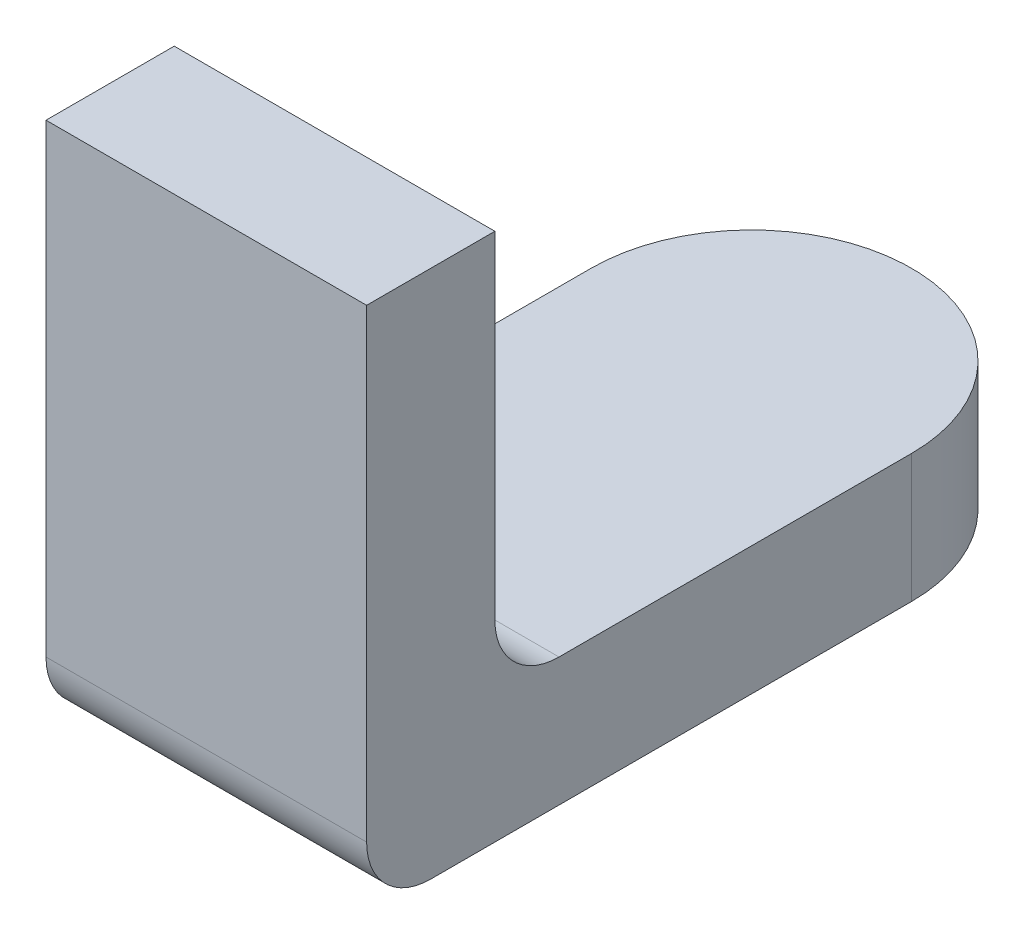
ISO-10303-21;
HEADER;
FILE_DESCRIPTION(('STEP AP214'),'2;1');
FILE_NAME('part.step','',(''),(''),'','','');
FILE_SCHEMA(('AUTOMOTIVE_DESIGN { 1 0 10303 214 1 1 1 1 }'));
ENDSEC;
DATA;
#1=APPLICATION_CONTEXT('core data for automotive mechanical design processes');
#2=APPLICATION_PROTOCOL_DEFINITION('international standard','automotive_design',2000,#1);
#3=PRODUCT_CONTEXT('',#1,'mechanical');
#4=PRODUCT('Part','Part','',(#3));
#5=PRODUCT_RELATED_PRODUCT_CATEGORY('part','',(#4));
#6=PRODUCT_DEFINITION_FORMATION('','',#4);
#7=PRODUCT_DEFINITION_CONTEXT('part definition',#1,'design');
#8=PRODUCT_DEFINITION('design','',#6,#7);
#9=PRODUCT_DEFINITION_SHAPE('','',#8);
#10=(LENGTH_UNIT() NAMED_UNIT(*) SI_UNIT(.MILLI.,.METRE.));
#11=(NAMED_UNIT(*) PLANE_ANGLE_UNIT() SI_UNIT($,.RADIAN.));
#12=(NAMED_UNIT(*) SI_UNIT($,.STERADIAN.) SOLID_ANGLE_UNIT());
#13=UNCERTAINTY_MEASURE_WITH_UNIT(LENGTH_MEASURE(1.E-05),#10,'distance_accuracy_value','');
#14=(GEOMETRIC_REPRESENTATION_CONTEXT(3) GLOBAL_UNCERTAINTY_ASSIGNED_CONTEXT((#13)) GLOBAL_UNIT_ASSIGNED_CONTEXT((#10,
#11,#12)) REPRESENTATION_CONTEXT('',''));
#15=CARTESIAN_POINT('',(0.,0.,0.));
#16=DIRECTION('',(0.,0.,1.));
#17=DIRECTION('',(1.,0.,0.));
#18=AXIS2_PLACEMENT_3D('',#15,#16,#17);
#19=CARTESIAN_POINT('',(10.,8.,-34.));
#20=DIRECTION('',(0.,-1.,0.));
#21=DIRECTION('',(0.,0.,-1.));
#22=AXIS2_PLACEMENT_3D('',#19,#20,#21);
#23=PLANE('',#22);
#24=DIRECTION('',(0.,0.,1.));
#25=VECTOR('',#24,1.);
#26=CARTESIAN_POINT('',(0.,8.,0.));
#27=LINE('',#26,#25);
#28=CARTESIAN_POINT('',(0.,8.,-34.));
#29=VERTEX_POINT('',#28);
#30=CARTESIAN_POINT('',(0.,8.,-12.));
#31=VERTEX_POINT('',#30);
#32=EDGE_CURVE('E136',#29,#31,#27,.T.);
#33=ORIENTED_EDGE('',*,*,#32,.T.);
#34=DIRECTION('',(-1.,0.,0.));
#35=VECTOR('',#34,1.);
#36=CARTESIAN_POINT('',(20.,8.,-12.));
#37=LINE('',#36,#35);
#38=CARTESIAN_POINT('',(20.,8.,-12.));
#39=VERTEX_POINT('',#38);
#40=EDGE_CURVE('E174',#31,#39,#37,.F.);
#41=ORIENTED_EDGE('',*,*,#40,.T.);
#42=DIRECTION('',(0.,0.,-1.));
#43=VECTOR('',#42,1.);
#44=CARTESIAN_POINT('',(20.,8.,0.));
#45=LINE('',#44,#43);
#46=CARTESIAN_POINT('',(20.,8.,-34.));
#47=VERTEX_POINT('',#46);
#48=EDGE_CURVE('E140',#39,#47,#45,.T.);
#49=ORIENTED_EDGE('',*,*,#48,.T.);
#50=CARTESIAN_POINT('',(10.,8.,-34.));
#51=DIRECTION('',(0.,1.,0.));
#52=DIRECTION('',(0.,0.,-1.));
#53=AXIS2_PLACEMENT_3D('',#50,#51,#52);
#54=CIRCLE('',#53,10.);
#55=EDGE_CURVE('E144',#47,#29,#54,.T.);
#56=ORIENTED_EDGE('',*,*,#55,.T.);
#57=EDGE_LOOP('',(#33,#41,#49,#56));
#58=FACE_BOUND('',#57,.T.);
#59=ADVANCED_FACE('F41',(#58),#23,.F.);
#60=CARTESIAN_POINT('',(0.,8.,0.));
#61=DIRECTION('',(1.,0.,0.));
#62=DIRECTION('',(0.,0.,-1.));
#63=AXIS2_PLACEMENT_3D('',#60,#61,#62);
#64=PLANE('',#63);
#65=DIRECTION('',(0.,0.,1.));
#66=VECTOR('',#65,1.);
#67=CARTESIAN_POINT('',(0.,0.,0.));
#68=LINE('',#67,#66);
#69=CARTESIAN_POINT('',(0.,0.,-34.));
#70=VERTEX_POINT('',#69);
#71=CARTESIAN_POINT('',(0.,0.,-4.));
#72=VERTEX_POINT('',#71);
#73=EDGE_CURVE('E148',#70,#72,#68,.T.);
#74=ORIENTED_EDGE('',*,*,#73,.T.);
#75=CARTESIAN_POINT('',(0.,4.,-4.));
#76=DIRECTION('',(1.,0.,0.));
#77=DIRECTION('',(0.,0.,-1.));
#78=AXIS2_PLACEMENT_3D('',#75,#76,#77);
#79=CIRCLE('',#78,4.);
#80=CARTESIAN_POINT('',(0.,4.,0.));
#81=VERTEX_POINT('',#80);
#82=EDGE_CURVE('E185',#72,#81,#79,.F.);
#83=ORIENTED_EDGE('',*,*,#82,.T.);
#84=DIRECTION('',(0.,-1.,0.));
#85=VECTOR('',#84,1.);
#86=CARTESIAN_POINT('',(0.,8.,0.));
#87=LINE('',#86,#85);
#88=CARTESIAN_POINT('',(0.,33.,0.));
#89=VERTEX_POINT('',#88);
#90=EDGE_CURVE('E167',#89,#81,#87,.T.);
#91=ORIENTED_EDGE('',*,*,#90,.F.);
#92=DIRECTION('',(0.,0.,-1.));
#93=VECTOR('',#92,1.);
#94=CARTESIAN_POINT('',(0.,33.,0.));
#95=LINE('',#94,#93);
#96=CARTESIAN_POINT('',(0.,33.,-8.));
#97=VERTEX_POINT('',#96);
#98=EDGE_CURVE('E152',#89,#97,#95,.T.);
#99=ORIENTED_EDGE('',*,*,#98,.T.);
#100=DIRECTION('',(0.,-1.,0.));
#101=VECTOR('',#100,1.);
#102=CARTESIAN_POINT('',(0.,87.540659228538,-8.));
#103=LINE('',#102,#101);
#104=CARTESIAN_POINT('',(0.,12.,-8.));
#105=VERTEX_POINT('',#104);
#106=EDGE_CURVE('E127',#97,#105,#103,.T.);
#107=ORIENTED_EDGE('',*,*,#106,.T.);
#108=CARTESIAN_POINT('',(0.,12.,-12.));
#109=DIRECTION('',(1.,0.,0.));
#110=DIRECTION('',(0.,0.,-1.));
#111=AXIS2_PLACEMENT_3D('',#108,#109,#110);
#112=CIRCLE('',#111,4.);
#113=EDGE_CURVE('E50',#105,#31,#112,.T.);
#114=ORIENTED_EDGE('',*,*,#113,.T.);
#115=ORIENTED_EDGE('',*,*,#32,.F.);
#116=DIRECTION('',(0.,-1.,0.));
#117=VECTOR('',#116,1.);
#118=CARTESIAN_POINT('',(0.,8.,-34.));
#119=LINE('',#118,#117);
#120=EDGE_CURVE('E147',#29,#70,#119,.T.);
#121=ORIENTED_EDGE('',*,*,#120,.T.);
#122=EDGE_LOOP('',(#74,#83,#91,#99,#107,#114,#115,#121));
#123=FACE_BOUND('',#122,.T.);
#124=ADVANCED_FACE('F190',(#123),#64,.F.);
#125=CARTESIAN_POINT('',(0.,8.,0.));
#126=DIRECTION('',(0.,0.,-1.));
#127=DIRECTION('',(-1.,0.,0.));
#128=AXIS2_PLACEMENT_3D('',#125,#126,#127);
#129=PLANE('',#128);
#130=ORIENTED_EDGE('',*,*,#90,.T.);
#131=DIRECTION('',(1.,0.,0.));
#132=VECTOR('',#131,1.);
#133=CARTESIAN_POINT('',(20.,4.,0.));
#134=LINE('',#133,#132);
#135=CARTESIAN_POINT('',(20.,4.,0.));
#136=VERTEX_POINT('',#135);
#137=EDGE_CURVE('E177',#81,#136,#134,.T.);
#138=ORIENTED_EDGE('',*,*,#137,.T.);
#139=DIRECTION('',(0.,-1.,0.));
#140=VECTOR('',#139,1.);
#141=CARTESIAN_POINT('',(20.,8.,0.));
#142=LINE('',#141,#140);
#143=CARTESIAN_POINT('',(20.,33.,0.));
#144=VERTEX_POINT('',#143);
#145=EDGE_CURVE('E164',#144,#136,#142,.T.);
#146=ORIENTED_EDGE('',*,*,#145,.F.);
#147=DIRECTION('',(-1.,0.,0.));
#148=VECTOR('',#147,1.);
#149=CARTESIAN_POINT('',(0.,33.,0.));
#150=LINE('',#149,#148);
#151=EDGE_CURVE('E115',#144,#89,#150,.T.);
#152=ORIENTED_EDGE('',*,*,#151,.T.);
#153=EDGE_LOOP('',(#130,#138,#146,#152));
#154=FACE_BOUND('',#153,.T.);
#155=ADVANCED_FACE('F210',(#154),#129,.F.);
#156=CARTESIAN_POINT('',(20.,8.,0.));
#157=DIRECTION('',(-1.,0.,0.));
#158=DIRECTION('',(0.,0.,1.));
#159=AXIS2_PLACEMENT_3D('',#156,#157,#158);
#160=PLANE('',#159);
#161=ORIENTED_EDGE('',*,*,#145,.T.);
#162=CARTESIAN_POINT('',(20.,4.,-4.));
#163=DIRECTION('',(-1.,0.,0.));
#164=DIRECTION('',(0.,0.,1.));
#165=AXIS2_PLACEMENT_3D('',#162,#163,#164);
#166=CIRCLE('',#165,4.);
#167=CARTESIAN_POINT('',(20.,0.,-4.));
#168=VERTEX_POINT('',#167);
#169=EDGE_CURVE('E65',#136,#168,#166,.F.);
#170=ORIENTED_EDGE('',*,*,#169,.T.);
#171=DIRECTION('',(0.,0.,-1.));
#172=VECTOR('',#171,1.);
#173=CARTESIAN_POINT('',(20.,0.,0.));
#174=LINE('',#173,#172);
#175=CARTESIAN_POINT('',(20.,0.,-34.));
#176=VERTEX_POINT('',#175);
#177=EDGE_CURVE('E151',#168,#176,#174,.T.);
#178=ORIENTED_EDGE('',*,*,#177,.T.);
#179=DIRECTION('',(0.,-1.,0.));
#180=VECTOR('',#179,1.);
#181=CARTESIAN_POINT('',(20.,8.,-34.));
#182=LINE('',#181,#180);
#183=EDGE_CURVE('E160',#47,#176,#182,.T.);
#184=ORIENTED_EDGE('',*,*,#183,.F.);
#185=ORIENTED_EDGE('',*,*,#48,.F.);
#186=CARTESIAN_POINT('',(20.,12.,-12.));
#187=DIRECTION('',(-1.,0.,0.));
#188=DIRECTION('',(0.,0.,1.));
#189=AXIS2_PLACEMENT_3D('',#186,#187,#188);
#190=CIRCLE('',#189,4.);
#191=CARTESIAN_POINT('',(20.,12.,-8.));
#192=VERTEX_POINT('',#191);
#193=EDGE_CURVE('E12',#39,#192,#190,.T.);
#194=ORIENTED_EDGE('',*,*,#193,.T.);
#195=DIRECTION('',(0.,-1.,0.));
#196=VECTOR('',#195,1.);
#197=CARTESIAN_POINT('',(20.,87.540659228538,-8.));
#198=LINE('',#197,#196);
#199=CARTESIAN_POINT('',(20.,33.,-8.));
#200=VERTEX_POINT('',#199);
#201=EDGE_CURVE('E119',#200,#192,#198,.T.);
#202=ORIENTED_EDGE('',*,*,#201,.F.);
#203=DIRECTION('',(0.,0.,1.));
#204=VECTOR('',#203,1.);
#205=CARTESIAN_POINT('',(20.,33.,0.));
#206=LINE('',#205,#204);
#207=EDGE_CURVE('E107',#200,#144,#206,.T.);
#208=ORIENTED_EDGE('',*,*,#207,.T.);
#209=EDGE_LOOP('',(#161,#170,#178,#184,#185,#194,#202,#208));
#210=FACE_BOUND('',#209,.T.);
#211=ADVANCED_FACE('F120',(#210),#160,.F.);
#212=CARTESIAN_POINT('',(10.,8.,-34.));
#213=DIRECTION('',(0.,-1.,0.));
#214=DIRECTION('',(0.,0.,-1.));
#215=AXIS2_PLACEMENT_3D('',#212,#213,#214);
#216=CYLINDRICAL_SURFACE('',#215,10.);
#217=CARTESIAN_POINT('',(10.,0.,-34.));
#218=DIRECTION('',(0.,1.,0.));
#219=DIRECTION('',(0.,0.,-1.));
#220=AXIS2_PLACEMENT_3D('',#217,#218,#219);
#221=CIRCLE('',#220,10.);
#222=EDGE_CURVE('E141',#176,#70,#221,.T.);
#223=ORIENTED_EDGE('',*,*,#222,.T.);
#224=ORIENTED_EDGE('',*,*,#120,.F.);
#225=ORIENTED_EDGE('',*,*,#55,.F.);
#226=ORIENTED_EDGE('',*,*,#183,.T.);
#227=EDGE_LOOP('',(#223,#224,#225,#226));
#228=FACE_BOUND('',#227,.T.);
#229=ADVANCED_FACE('F216',(#228),#216,.T.);
#230=CARTESIAN_POINT('',(10.,0.,-34.));
#231=DIRECTION('',(0.,-1.,0.));
#232=DIRECTION('',(0.,0.,-1.));
#233=AXIS2_PLACEMENT_3D('',#230,#231,#232);
#234=PLANE('',#233);
#235=ORIENTED_EDGE('',*,*,#177,.F.);
#236=DIRECTION('',(1.,0.,0.));
#237=VECTOR('',#236,1.);
#238=CARTESIAN_POINT('',(0.,0.,-4.));
#239=LINE('',#238,#237);
#240=EDGE_CURVE('E57',#168,#72,#239,.F.);
#241=ORIENTED_EDGE('',*,*,#240,.T.);
#242=ORIENTED_EDGE('',*,*,#73,.F.);
#243=ORIENTED_EDGE('',*,*,#222,.F.);
#244=EDGE_LOOP('',(#235,#241,#242,#243));
#245=FACE_BOUND('',#244,.T.);
#246=ADVANCED_FACE('F213',(#245),#234,.T.);
#247=CARTESIAN_POINT('',(0.,87.540659228538,-8.));
#248=DIRECTION('',(0.,0.,1.));
#249=DIRECTION('',(1.,0.,0.));
#250=AXIS2_PLACEMENT_3D('',#247,#248,#249);
#251=PLANE('',#250);
#252=ORIENTED_EDGE('',*,*,#201,.T.);
#253=DIRECTION('',(-1.,0.,0.));
#254=VECTOR('',#253,1.);
#255=CARTESIAN_POINT('',(0.,12.,-8.));
#256=LINE('',#255,#254);
#257=EDGE_CURVE('E171',#192,#105,#256,.T.);
#258=ORIENTED_EDGE('',*,*,#257,.T.);
#259=ORIENTED_EDGE('',*,*,#106,.F.);
#260=DIRECTION('',(1.,0.,0.));
#261=VECTOR('',#260,1.);
#262=CARTESIAN_POINT('',(0.,33.,-8.));
#263=LINE('',#262,#261);
#264=EDGE_CURVE('E112',#97,#200,#263,.T.);
#265=ORIENTED_EDGE('',*,*,#264,.T.);
#266=EDGE_LOOP('',(#252,#258,#259,#265));
#267=FACE_BOUND('',#266,.T.);
#268=ADVANCED_FACE('F130',(#267),#251,.F.);
#269=CARTESIAN_POINT('',(10.,33.,-34.));
#270=DIRECTION('',(0.,-1.,0.));
#271=DIRECTION('',(0.,0.,-1.));
#272=AXIS2_PLACEMENT_3D('',#269,#270,#271);
#273=PLANE('',#272);
#274=ORIENTED_EDGE('',*,*,#151,.F.);
#275=ORIENTED_EDGE('',*,*,#207,.F.);
#276=ORIENTED_EDGE('',*,*,#264,.F.);
#277=ORIENTED_EDGE('',*,*,#98,.F.);
#278=EDGE_LOOP('',(#274,#275,#276,#277));
#279=FACE_BOUND('',#278,.T.);
#280=ADVANCED_FACE('F109',(#279),#273,.F.);
#281=CARTESIAN_POINT('',(0.,12.,-12.));
#282=DIRECTION('',(1.,0.,0.));
#283=DIRECTION('',(0.,0.,-1.));
#284=AXIS2_PLACEMENT_3D('',#281,#282,#283);
#285=CYLINDRICAL_SURFACE('',#284,4.);
#286=ORIENTED_EDGE('',*,*,#193,.F.);
#287=ORIENTED_EDGE('',*,*,#40,.F.);
#288=ORIENTED_EDGE('',*,*,#113,.F.);
#289=ORIENTED_EDGE('',*,*,#257,.F.);
#290=EDGE_LOOP('',(#286,#287,#288,#289));
#291=FACE_BOUND('',#290,.T.);
#292=ADVANCED_FACE('F196',(#291),#285,.F.);
#293=CARTESIAN_POINT('',(0.,4.,-4.));
#294=DIRECTION('',(-1.,0.,0.));
#295=DIRECTION('',(0.,0.,1.));
#296=AXIS2_PLACEMENT_3D('',#293,#294,#295);
#297=CYLINDRICAL_SURFACE('',#296,4.);
#298=ORIENTED_EDGE('',*,*,#82,.F.);
#299=ORIENTED_EDGE('',*,*,#240,.F.);
#300=ORIENTED_EDGE('',*,*,#169,.F.);
#301=ORIENTED_EDGE('',*,*,#137,.F.);
#302=EDGE_LOOP('',(#298,#299,#300,#301));
#303=FACE_BOUND('',#302,.T.);
#304=ADVANCED_FACE('F43',(#303),#297,.T.);
#305=CLOSED_SHELL('',(#59,#124,#155,#211,#229,#246,#268,#280,#292,#304));
#306=MANIFOLD_SOLID_BREP('B2',#305);
#307=ADVANCED_BREP_SHAPE_REPRESENTATION('',(#18,#306),#14);
#308=SHAPE_DEFINITION_REPRESENTATION(#9,#307);
ENDSEC;
END-ISO-10303-21;
